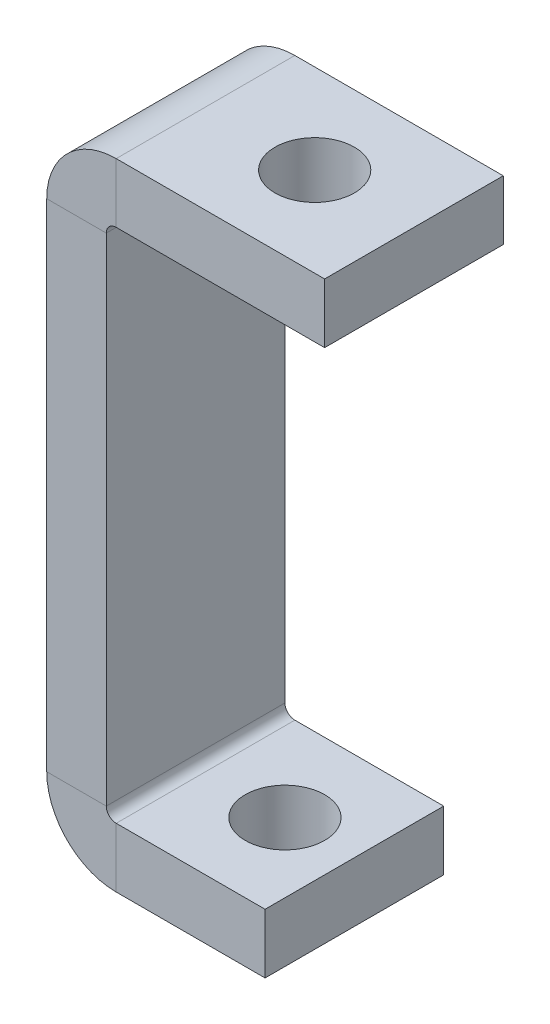
ISO-10303-21;
HEADER;
FILE_DESCRIPTION(('STEP AP214'),'2;1');
FILE_NAME('part.step','',(''),(''),'','','');
FILE_SCHEMA(('AUTOMOTIVE_DESIGN { 1 0 10303 214 1 1 1 1 }'));
ENDSEC;
DATA;
#1=APPLICATION_CONTEXT('core data for automotive mechanical design processes');
#2=APPLICATION_PROTOCOL_DEFINITION('international standard','automotive_design',2000,#1);
#3=PRODUCT_CONTEXT('',#1,'mechanical');
#4=PRODUCT('Part','Part','',(#3));
#5=PRODUCT_RELATED_PRODUCT_CATEGORY('part','',(#4));
#6=PRODUCT_DEFINITION_FORMATION('','',#4);
#7=PRODUCT_DEFINITION_CONTEXT('part definition',#1,'design');
#8=PRODUCT_DEFINITION('design','',#6,#7);
#9=PRODUCT_DEFINITION_SHAPE('','',#8);
#10=(LENGTH_UNIT() NAMED_UNIT(*) SI_UNIT(.MILLI.,.METRE.));
#11=(NAMED_UNIT(*) PLANE_ANGLE_UNIT() SI_UNIT($,.RADIAN.));
#12=(NAMED_UNIT(*) SI_UNIT($,.STERADIAN.) SOLID_ANGLE_UNIT());
#13=UNCERTAINTY_MEASURE_WITH_UNIT(LENGTH_MEASURE(1.E-05),#10,'distance_accuracy_value','');
#14=(GEOMETRIC_REPRESENTATION_CONTEXT(3) GLOBAL_UNCERTAINTY_ASSIGNED_CONTEXT((#13)) GLOBAL_UNIT_ASSIGNED_CONTEXT((#10,
#11,#12)) REPRESENTATION_CONTEXT('',''));
#15=CARTESIAN_POINT('',(0.,0.,0.));
#16=DIRECTION('',(0.,0.,1.));
#17=DIRECTION('',(1.,0.,0.));
#18=AXIS2_PLACEMENT_3D('',#15,#16,#17);
#19=CARTESIAN_POINT('',(0.,0.,0.));
#20=DIRECTION('',(1.,0.,0.));
#21=DIRECTION('',(0.,0.,-1.));
#22=AXIS2_PLACEMENT_3D('',#19,#20,#21);
#23=PLANE('',#22);
#24=DIRECTION('',(0.,-1.,0.));
#25=VECTOR('',#24,1.);
#26=CARTESIAN_POINT('',(0.,0.,4.5));
#27=LINE('',#26,#25);
#28=CARTESIAN_POINT('',(0.,0.,4.5));
#29=VERTEX_POINT('',#28);
#30=CARTESIAN_POINT('',(0.,-3.,4.5));
#31=VERTEX_POINT('',#30);
#32=EDGE_CURVE('E149',#29,#31,#27,.T.);
#33=ORIENTED_EDGE('',*,*,#32,.T.);
#34=DIRECTION('',(0.,0.,-1.));
#35=VECTOR('',#34,1.);
#36=CARTESIAN_POINT('',(0.,-3.,4.5));
#37=LINE('',#36,#35);
#38=CARTESIAN_POINT('',(0.,-3.,-4.5));
#39=VERTEX_POINT('',#38);
#40=EDGE_CURVE('E160',#31,#39,#37,.T.);
#41=ORIENTED_EDGE('',*,*,#40,.T.);
#42=DIRECTION('',(0.,1.,0.));
#43=VECTOR('',#42,1.);
#44=CARTESIAN_POINT('',(0.,0.,-4.5));
#45=LINE('',#44,#43);
#46=CARTESIAN_POINT('',(0.,0.,-4.5));
#47=VERTEX_POINT('',#46);
#48=EDGE_CURVE('E165',#39,#47,#45,.T.);
#49=ORIENTED_EDGE('',*,*,#48,.T.);
#50=DIRECTION('',(0.,0.,1.));
#51=VECTOR('',#50,1.);
#52=CARTESIAN_POINT('',(0.,0.,4.5));
#53=LINE('',#52,#51);
#54=EDGE_CURVE('E164',#47,#29,#53,.T.);
#55=ORIENTED_EDGE('',*,*,#54,.T.);
#56=EDGE_LOOP('',(#33,#41,#49,#55));
#57=FACE_BOUND('',#56,.T.);
#58=ADVANCED_FACE('F38',(#57),#23,.T.);
#59=CARTESIAN_POINT('',(3.,26.,0.));
#60=DIRECTION('',(-1.,0.,0.));
#61=DIRECTION('',(0.,0.,-1.));
#62=AXIS2_PLACEMENT_3D('',#59,#60,#61);
#63=PLANE('',#62);
#64=DIRECTION('',(0.,1.,0.));
#65=VECTOR('',#64,1.);
#66=CARTESIAN_POINT('',(3.,26.,4.5));
#67=LINE('',#66,#65);
#68=CARTESIAN_POINT('',(3.,26.,4.5));
#69=VERTEX_POINT('',#68);
#70=CARTESIAN_POINT('',(3.,29.,4.5));
#71=VERTEX_POINT('',#70);
#72=EDGE_CURVE('E221',#69,#71,#67,.T.);
#73=ORIENTED_EDGE('',*,*,#72,.F.);
#74=DIRECTION('',(0.,0.,1.));
#75=VECTOR('',#74,1.);
#76=CARTESIAN_POINT('',(3.,26.,4.5));
#77=LINE('',#76,#75);
#78=CARTESIAN_POINT('',(3.,26.,-4.5));
#79=VERTEX_POINT('',#78);
#80=EDGE_CURVE('E11',#79,#69,#77,.T.);
#81=ORIENTED_EDGE('',*,*,#80,.F.);
#82=DIRECTION('',(0.,-1.,0.));
#83=VECTOR('',#82,1.);
#84=CARTESIAN_POINT('',(3.,26.,-4.5));
#85=LINE('',#84,#83);
#86=CARTESIAN_POINT('',(3.,29.,-4.5));
#87=VERTEX_POINT('',#86);
#88=EDGE_CURVE('E55',#87,#79,#85,.T.);
#89=ORIENTED_EDGE('',*,*,#88,.F.);
#90=DIRECTION('',(0.,0.,-1.));
#91=VECTOR('',#90,1.);
#92=CARTESIAN_POINT('',(3.,29.,4.5));
#93=LINE('',#92,#91);
#94=EDGE_CURVE('E64',#71,#87,#93,.T.);
#95=ORIENTED_EDGE('',*,*,#94,.F.);
#96=EDGE_LOOP('',(#73,#81,#89,#95));
#97=FACE_BOUND('',#96,.T.);
#98=ADVANCED_FACE('F370',(#97),#63,.F.);
#99=CARTESIAN_POINT('',(0.,0.,4.5));
#100=DIRECTION('',(0.,0.,-1.));
#101=DIRECTION('',(0.,1.,0.));
#102=AXIS2_PLACEMENT_3D('',#99,#100,#101);
#103=PLANE('',#102);
#104=DIRECTION('',(-1.,0.,0.));
#105=VECTOR('',#104,1.);
#106=CARTESIAN_POINT('',(0.,-3.,4.5));
#107=LINE('',#106,#105);
#108=CARTESIAN_POINT('',(-7.5,-3.,4.5));
#109=VERTEX_POINT('',#108);
#110=EDGE_CURVE('E156',#31,#109,#107,.T.);
#111=ORIENTED_EDGE('',*,*,#110,.F.);
#112=ORIENTED_EDGE('',*,*,#32,.F.);
#113=DIRECTION('',(-1.,0.,0.));
#114=VECTOR('',#113,1.);
#115=CARTESIAN_POINT('',(0.,0.,4.5));
#116=LINE('',#115,#114);
#117=CARTESIAN_POINT('',(-7.5,0.,4.5));
#118=VERTEX_POINT('',#117);
#119=EDGE_CURVE('E154',#29,#118,#116,.T.);
#120=ORIENTED_EDGE('',*,*,#119,.T.);
#121=DIRECTION('',(0.,-1.,0.));
#122=VECTOR('',#121,1.);
#123=CARTESIAN_POINT('',(-7.5,0.,4.5));
#124=LINE('',#123,#122);
#125=EDGE_CURVE('E177',#118,#109,#124,.T.);
#126=ORIENTED_EDGE('',*,*,#125,.T.);
#127=EDGE_LOOP('',(#111,#112,#120,#126));
#128=FACE_BOUND('',#127,.T.);
#129=ADVANCED_FACE('F151',(#128),#103,.F.);
#130=CARTESIAN_POINT('',(0.,-3.,4.5));
#131=DIRECTION('',(0.,1.,0.));
#132=DIRECTION('',(0.,0.,1.));
#133=AXIS2_PLACEMENT_3D('',#130,#131,#132);
#134=PLANE('',#133);
#135=CARTESIAN_POINT('',(-3.5,-3.,0.));
#136=DIRECTION('',(0.,-1.,0.));
#137=DIRECTION('',(0.,0.,-1.));
#138=AXIS2_PLACEMENT_3D('',#135,#136,#137);
#139=CIRCLE('',#138,2.);
#140=CARTESIAN_POINT('',(-3.5,-3.,-2.));
#141=VERTEX_POINT('',#140);
#142=EDGE_CURVE('E322',#141,#141,#139,.T.);
#143=ORIENTED_EDGE('',*,*,#142,.F.);
#144=EDGE_LOOP('',(#143));
#145=FACE_BOUND('',#144,.T.);
#146=DIRECTION('',(-1.,0.,0.));
#147=VECTOR('',#146,1.);
#148=CARTESIAN_POINT('',(0.,-3.,-4.5));
#149=LINE('',#148,#147);
#150=CARTESIAN_POINT('',(-7.5,-3.,-4.5));
#151=VERTEX_POINT('',#150);
#152=EDGE_CURVE('E237',#39,#151,#149,.T.);
#153=ORIENTED_EDGE('',*,*,#152,.F.);
#154=ORIENTED_EDGE('',*,*,#40,.F.);
#155=ORIENTED_EDGE('',*,*,#110,.T.);
#156=DIRECTION('',(0.,0.,-1.));
#157=VECTOR('',#156,1.);
#158=CARTESIAN_POINT('',(-7.5,-3.,4.5));
#159=LINE('',#158,#157);
#160=EDGE_CURVE('E233',#109,#151,#159,.T.);
#161=ORIENTED_EDGE('',*,*,#160,.T.);
#162=EDGE_LOOP('',(#153,#154,#155,#161));
#163=FACE_BOUND('',#162,.T.);
#164=ADVANCED_FACE('F331',(#145,#163),#134,.F.);
#165=CARTESIAN_POINT('',(0.,0.,-4.5));
#166=DIRECTION('',(0.,0.,1.));
#167=DIRECTION('',(0.,-1.,0.));
#168=AXIS2_PLACEMENT_3D('',#165,#166,#167);
#169=PLANE('',#168);
#170=DIRECTION('',(-1.,0.,0.));
#171=VECTOR('',#170,1.);
#172=CARTESIAN_POINT('',(0.,0.,-4.5));
#173=LINE('',#172,#171);
#174=CARTESIAN_POINT('',(-7.5,0.,-4.5));
#175=VERTEX_POINT('',#174);
#176=EDGE_CURVE('E272',#47,#175,#173,.T.);
#177=ORIENTED_EDGE('',*,*,#176,.F.);
#178=ORIENTED_EDGE('',*,*,#48,.F.);
#179=ORIENTED_EDGE('',*,*,#152,.T.);
#180=DIRECTION('',(0.,1.,0.));
#181=VECTOR('',#180,1.);
#182=CARTESIAN_POINT('',(-7.5,0.,-4.5));
#183=LINE('',#182,#181);
#184=EDGE_CURVE('E241',#151,#175,#183,.T.);
#185=ORIENTED_EDGE('',*,*,#184,.T.);
#186=EDGE_LOOP('',(#177,#178,#179,#185));
#187=FACE_BOUND('',#186,.T.);
#188=ADVANCED_FACE('F334',(#187),#169,.F.);
#189=CARTESIAN_POINT('',(0.,0.,4.5));
#190=DIRECTION('',(0.,-1.,0.));
#191=DIRECTION('',(1.,0.,0.));
#192=AXIS2_PLACEMENT_3D('',#189,#190,#191);
#193=PLANE('',#192);
#194=CARTESIAN_POINT('',(-3.5,0.,0.));
#195=DIRECTION('',(0.,-1.,0.));
#196=DIRECTION('',(1.,0.,0.));
#197=AXIS2_PLACEMENT_3D('',#194,#195,#196);
#198=CIRCLE('',#197,2.);
#199=CARTESIAN_POINT('',(-1.5,0.,0.));
#200=VERTEX_POINT('',#199);
#201=EDGE_CURVE('E41',#200,#200,#198,.T.);
#202=ORIENTED_EDGE('',*,*,#201,.T.);
#203=EDGE_LOOP('',(#202));
#204=FACE_BOUND('',#203,.T.);
#205=DIRECTION('',(0.,0.,1.));
#206=VECTOR('',#205,1.);
#207=CARTESIAN_POINT('',(-7.5,0.,4.5));
#208=LINE('',#207,#206);
#209=EDGE_CURVE('E174',#175,#118,#208,.T.);
#210=ORIENTED_EDGE('',*,*,#209,.T.);
#211=ORIENTED_EDGE('',*,*,#119,.F.);
#212=ORIENTED_EDGE('',*,*,#54,.F.);
#213=ORIENTED_EDGE('',*,*,#176,.T.);
#214=EDGE_LOOP('',(#210,#211,#212,#213));
#215=FACE_BOUND('',#214,.T.);
#216=ADVANCED_FACE('F172',(#204,#215),#193,.F.);
#217=CARTESIAN_POINT('',(-7.5,0.,4.5));
#218=DIRECTION('',(0.,0.,-1.));
#219=DIRECTION('',(-1.,0.,0.));
#220=AXIS2_PLACEMENT_3D('',#217,#218,#219);
#221=PLANE('',#220);
#222=CARTESIAN_POINT('',(-7.5,0.499999999999999,4.5));
#223=DIRECTION('',(0.,0.,-1.));
#224=DIRECTION('',(0.,-1.,0.));
#225=AXIS2_PLACEMENT_3D('',#222,#223,#224);
#226=CIRCLE('',#225,3.5);
#227=CARTESIAN_POINT('',(-11.,0.499999999999999,4.5));
#228=VERTEX_POINT('',#227);
#229=EDGE_CURVE('E187',#109,#228,#226,.T.);
#230=ORIENTED_EDGE('',*,*,#229,.F.);
#231=ORIENTED_EDGE('',*,*,#125,.F.);
#232=CARTESIAN_POINT('',(-7.5,0.499999999999999,4.5));
#233=DIRECTION('',(0.,0.,-1.));
#234=DIRECTION('',(0.,-1.,0.));
#235=AXIS2_PLACEMENT_3D('',#232,#233,#234);
#236=CIRCLE('',#235,0.5);
#237=CARTESIAN_POINT('',(-8.,0.499999999999999,4.5));
#238=VERTEX_POINT('',#237);
#239=EDGE_CURVE('E188',#118,#238,#236,.T.);
#240=ORIENTED_EDGE('',*,*,#239,.T.);
#241=DIRECTION('',(-1.,0.,0.));
#242=VECTOR('',#241,1.);
#243=CARTESIAN_POINT('',(-8.,0.499999999999999,4.5));
#244=LINE('',#243,#242);
#245=EDGE_CURVE('E183',#238,#228,#244,.T.);
#246=ORIENTED_EDGE('',*,*,#245,.T.);
#247=EDGE_LOOP('',(#230,#231,#240,#246));
#248=FACE_BOUND('',#247,.T.);
#249=ADVANCED_FACE('F348',(#248),#221,.F.);
#250=CARTESIAN_POINT('',(-7.5,0.499999999999999,0.));
#251=DIRECTION('',(0.,0.,-1.));
#252=DIRECTION('',(-1.,0.,0.));
#253=AXIS2_PLACEMENT_3D('',#250,#251,#252);
#254=CYLINDRICAL_SURFACE('',#253,3.5);
#255=CARTESIAN_POINT('',(-7.5,0.499999999999999,-4.5));
#256=DIRECTION('',(0.,0.,-1.));
#257=DIRECTION('',(0.,-1.,0.));
#258=AXIS2_PLACEMENT_3D('',#255,#256,#257);
#259=CIRCLE('',#258,3.5);
#260=CARTESIAN_POINT('',(-11.,0.499999999999999,-4.5));
#261=VERTEX_POINT('',#260);
#262=EDGE_CURVE('E245',#151,#261,#259,.T.);
#263=ORIENTED_EDGE('',*,*,#262,.F.);
#264=ORIENTED_EDGE('',*,*,#160,.F.);
#265=ORIENTED_EDGE('',*,*,#229,.T.);
#266=DIRECTION('',(0.,0.,-1.));
#267=VECTOR('',#266,1.);
#268=CARTESIAN_POINT('',(-11.,0.499999999999999,4.5));
#269=LINE('',#268,#267);
#270=EDGE_CURVE('E192',#228,#261,#269,.T.);
#271=ORIENTED_EDGE('',*,*,#270,.T.);
#272=EDGE_LOOP('',(#263,#264,#265,#271));
#273=FACE_BOUND('',#272,.T.);
#274=ADVANCED_FACE('F350',(#273),#254,.T.);
#275=CARTESIAN_POINT('',(-7.5,0.,-4.5));
#276=DIRECTION('',(0.,0.,1.));
#277=DIRECTION('',(1.,0.,0.));
#278=AXIS2_PLACEMENT_3D('',#275,#276,#277);
#279=PLANE('',#278);
#280=CARTESIAN_POINT('',(-7.5,0.499999999999999,-4.5));
#281=DIRECTION('',(0.,0.,-1.));
#282=DIRECTION('',(0.,-1.,0.));
#283=AXIS2_PLACEMENT_3D('',#280,#281,#282);
#284=CIRCLE('',#283,0.5);
#285=CARTESIAN_POINT('',(-8.,0.499999999999999,-4.5));
#286=VERTEX_POINT('',#285);
#287=EDGE_CURVE('E278',#175,#286,#284,.T.);
#288=ORIENTED_EDGE('',*,*,#287,.F.);
#289=ORIENTED_EDGE('',*,*,#184,.F.);
#290=ORIENTED_EDGE('',*,*,#262,.T.);
#291=DIRECTION('',(1.,0.,0.));
#292=VECTOR('',#291,1.);
#293=CARTESIAN_POINT('',(-8.,0.499999999999999,-4.5));
#294=LINE('',#293,#292);
#295=EDGE_CURVE('E249',#261,#286,#294,.T.);
#296=ORIENTED_EDGE('',*,*,#295,.T.);
#297=EDGE_LOOP('',(#288,#289,#290,#296));
#298=FACE_BOUND('',#297,.T.);
#299=ADVANCED_FACE('F341',(#298),#279,.F.);
#300=CARTESIAN_POINT('',(-7.5,0.499999999999999,0.));
#301=DIRECTION('',(0.,0.,-1.));
#302=DIRECTION('',(-1.,0.,0.));
#303=AXIS2_PLACEMENT_3D('',#300,#301,#302);
#304=CYLINDRICAL_SURFACE('',#303,0.5);
#305=DIRECTION('',(0.,0.,1.));
#306=VECTOR('',#305,1.);
#307=CARTESIAN_POINT('',(-8.,0.499999999999999,4.5));
#308=LINE('',#307,#306);
#309=EDGE_CURVE('E209',#286,#238,#308,.T.);
#310=ORIENTED_EDGE('',*,*,#309,.T.);
#311=ORIENTED_EDGE('',*,*,#239,.F.);
#312=ORIENTED_EDGE('',*,*,#209,.F.);
#313=ORIENTED_EDGE('',*,*,#287,.T.);
#314=EDGE_LOOP('',(#310,#311,#312,#313));
#315=FACE_BOUND('',#314,.T.);
#316=ADVANCED_FACE('F344',(#315),#304,.F.);
#317=CARTESIAN_POINT('',(-8.,0.499999999999999,4.5));
#318=DIRECTION('',(0.,0.,-1.));
#319=DIRECTION('',(-1.,0.,0.));
#320=AXIS2_PLACEMENT_3D('',#317,#318,#319);
#321=PLANE('',#320);
#322=DIRECTION('',(0.,1.,0.));
#323=VECTOR('',#322,1.);
#324=CARTESIAN_POINT('',(-11.,0.499999999999999,4.5));
#325=LINE('',#324,#323);
#326=CARTESIAN_POINT('',(-11.,25.5,4.5));
#327=VERTEX_POINT('',#326);
#328=EDGE_CURVE('E200',#228,#327,#325,.T.);
#329=ORIENTED_EDGE('',*,*,#328,.F.);
#330=ORIENTED_EDGE('',*,*,#245,.F.);
#331=DIRECTION('',(0.,1.,0.));
#332=VECTOR('',#331,1.);
#333=CARTESIAN_POINT('',(-8.,0.499999999999999,4.5));
#334=LINE('',#333,#332);
#335=CARTESIAN_POINT('',(-8.,25.5,4.5));
#336=VERTEX_POINT('',#335);
#337=EDGE_CURVE('E201',#238,#336,#334,.T.);
#338=ORIENTED_EDGE('',*,*,#337,.T.);
#339=DIRECTION('',(-1.,0.,0.));
#340=VECTOR('',#339,1.);
#341=CARTESIAN_POINT('',(-8.,25.5,4.5));
#342=LINE('',#341,#340);
#343=EDGE_CURVE('E196',#336,#327,#342,.T.);
#344=ORIENTED_EDGE('',*,*,#343,.T.);
#345=EDGE_LOOP('',(#329,#330,#338,#344));
#346=FACE_BOUND('',#345,.T.);
#347=ADVANCED_FACE('F361',(#346),#321,.F.);
#348=CARTESIAN_POINT('',(-11.,0.499999999999999,4.5));
#349=DIRECTION('',(1.,0.,0.));
#350=DIRECTION('',(0.,0.,-1.));
#351=AXIS2_PLACEMENT_3D('',#348,#349,#350);
#352=PLANE('',#351);
#353=DIRECTION('',(0.,1.,0.));
#354=VECTOR('',#353,1.);
#355=CARTESIAN_POINT('',(-11.,0.499999999999999,-4.5));
#356=LINE('',#355,#354);
#357=CARTESIAN_POINT('',(-11.,25.5,-4.5));
#358=VERTEX_POINT('',#357);
#359=EDGE_CURVE('E253',#261,#358,#356,.T.);
#360=ORIENTED_EDGE('',*,*,#359,.F.);
#361=ORIENTED_EDGE('',*,*,#270,.F.);
#362=ORIENTED_EDGE('',*,*,#328,.T.);
#363=DIRECTION('',(0.,0.,-1.));
#364=VECTOR('',#363,1.);
#365=CARTESIAN_POINT('',(-11.,25.5,4.5));
#366=LINE('',#365,#364);
#367=EDGE_CURVE('E205',#327,#358,#366,.T.);
#368=ORIENTED_EDGE('',*,*,#367,.T.);
#369=EDGE_LOOP('',(#360,#361,#362,#368));
#370=FACE_BOUND('',#369,.T.);
#371=ADVANCED_FACE('F354',(#370),#352,.F.);
#372=CARTESIAN_POINT('',(-8.,0.499999999999999,-4.5));
#373=DIRECTION('',(0.,0.,1.));
#374=DIRECTION('',(1.,0.,0.));
#375=AXIS2_PLACEMENT_3D('',#372,#373,#374);
#376=PLANE('',#375);
#377=DIRECTION('',(0.,1.,0.));
#378=VECTOR('',#377,1.);
#379=CARTESIAN_POINT('',(-8.,0.499999999999999,-4.5));
#380=LINE('',#379,#378);
#381=CARTESIAN_POINT('',(-8.,25.5,-4.5));
#382=VERTEX_POINT('',#381);
#383=EDGE_CURVE('E285',#286,#382,#380,.T.);
#384=ORIENTED_EDGE('',*,*,#383,.F.);
#385=ORIENTED_EDGE('',*,*,#295,.F.);
#386=ORIENTED_EDGE('',*,*,#359,.T.);
#387=DIRECTION('',(1.,0.,0.));
#388=VECTOR('',#387,1.);
#389=CARTESIAN_POINT('',(-8.,25.5,-4.5));
#390=LINE('',#389,#388);
#391=EDGE_CURVE('E257',#358,#382,#390,.T.);
#392=ORIENTED_EDGE('',*,*,#391,.T.);
#393=EDGE_LOOP('',(#384,#385,#386,#392));
#394=FACE_BOUND('',#393,.T.);
#395=ADVANCED_FACE('F356',(#394),#376,.F.);
#396=CARTESIAN_POINT('',(-8.,0.499999999999999,4.5));
#397=DIRECTION('',(-1.,0.,0.));
#398=DIRECTION('',(0.,0.,1.));
#399=AXIS2_PLACEMENT_3D('',#396,#397,#398);
#400=PLANE('',#399);
#401=DIRECTION('',(0.,0.,1.));
#402=VECTOR('',#401,1.);
#403=CARTESIAN_POINT('',(-8.,25.5,4.5));
#404=LINE('',#403,#402);
#405=EDGE_CURVE('E220',#382,#336,#404,.T.);
#406=ORIENTED_EDGE('',*,*,#405,.T.);
#407=ORIENTED_EDGE('',*,*,#337,.F.);
#408=ORIENTED_EDGE('',*,*,#309,.F.);
#409=ORIENTED_EDGE('',*,*,#383,.T.);
#410=EDGE_LOOP('',(#406,#407,#408,#409));
#411=FACE_BOUND('',#410,.T.);
#412=ADVANCED_FACE('F358',(#411),#400,.F.);
#413=CARTESIAN_POINT('',(-8.,25.5,4.5));
#414=DIRECTION('',(0.,0.,-1.));
#415=DIRECTION('',(-1.,0.,0.));
#416=AXIS2_PLACEMENT_3D('',#413,#414,#415);
#417=PLANE('',#416);
#418=CARTESIAN_POINT('',(-7.5,25.5,4.5));
#419=DIRECTION('',(0.,0.,-1.));
#420=DIRECTION('',(-1.,0.,0.));
#421=AXIS2_PLACEMENT_3D('',#418,#419,#420);
#422=CIRCLE('',#421,3.5);
#423=CARTESIAN_POINT('',(-7.49999999999998,29.,4.5));
#424=VERTEX_POINT('',#423);
#425=EDGE_CURVE('E129',#327,#424,#422,.T.);
#426=ORIENTED_EDGE('',*,*,#425,.F.);
#427=ORIENTED_EDGE('',*,*,#343,.F.);
#428=CARTESIAN_POINT('',(-7.5,25.5,4.5));
#429=DIRECTION('',(0.,0.,-1.));
#430=DIRECTION('',(-1.,0.,0.));
#431=AXIS2_PLACEMENT_3D('',#428,#429,#430);
#432=CIRCLE('',#431,0.5);
#433=CARTESIAN_POINT('',(-7.5,26.,4.5));
#434=VERTEX_POINT('',#433);
#435=EDGE_CURVE('E213',#336,#434,#432,.T.);
#436=ORIENTED_EDGE('',*,*,#435,.T.);
#437=DIRECTION('',(0.,1.,0.));
#438=VECTOR('',#437,1.);
#439=CARTESIAN_POINT('',(-7.5,26.,4.5));
#440=LINE('',#439,#438);
#441=EDGE_CURVE('E210',#434,#424,#440,.T.);
#442=ORIENTED_EDGE('',*,*,#441,.T.);
#443=EDGE_LOOP('',(#426,#427,#436,#442));
#444=FACE_BOUND('',#443,.T.);
#445=ADVANCED_FACE('F362',(#444),#417,.F.);
#446=CARTESIAN_POINT('',(-7.5,25.5,0.));
#447=DIRECTION('',(0.,0.,-1.));
#448=DIRECTION('',(-1.,0.,0.));
#449=AXIS2_PLACEMENT_3D('',#446,#447,#448);
#450=CYLINDRICAL_SURFACE('',#449,3.5);
#451=CARTESIAN_POINT('',(-7.5,25.5,-4.5));
#452=DIRECTION('',(0.,0.,-1.));
#453=DIRECTION('',(-1.,0.,0.));
#454=AXIS2_PLACEMENT_3D('',#451,#452,#453);
#455=CIRCLE('',#454,3.5);
#456=CARTESIAN_POINT('',(-7.49999999999998,29.,-4.5));
#457=VERTEX_POINT('',#456);
#458=EDGE_CURVE('E122',#358,#457,#455,.T.);
#459=ORIENTED_EDGE('',*,*,#458,.F.);
#460=ORIENTED_EDGE('',*,*,#367,.F.);
#461=ORIENTED_EDGE('',*,*,#425,.T.);
#462=DIRECTION('',(0.,0.,-1.));
#463=VECTOR('',#462,1.);
#464=CARTESIAN_POINT('',(-7.49999999999998,29.,4.5));
#465=LINE('',#464,#463);
#466=EDGE_CURVE('E216',#424,#457,#465,.T.);
#467=ORIENTED_EDGE('',*,*,#466,.T.);
#468=EDGE_LOOP('',(#459,#460,#461,#467));
#469=FACE_BOUND('',#468,.T.);
#470=ADVANCED_FACE('F372',(#469),#450,.T.);
#471=CARTESIAN_POINT('',(-8.,25.5,-4.5));
#472=DIRECTION('',(0.,0.,1.));
#473=DIRECTION('',(1.,0.,0.));
#474=AXIS2_PLACEMENT_3D('',#471,#472,#473);
#475=PLANE('',#474);
#476=CARTESIAN_POINT('',(-7.5,25.5,-4.5));
#477=DIRECTION('',(0.,0.,-1.));
#478=DIRECTION('',(-1.,0.,0.));
#479=AXIS2_PLACEMENT_3D('',#476,#477,#478);
#480=CIRCLE('',#479,0.5);
#481=CARTESIAN_POINT('',(-7.5,26.,-4.5));
#482=VERTEX_POINT('',#481);
#483=EDGE_CURVE('E292',#382,#482,#480,.T.);
#484=ORIENTED_EDGE('',*,*,#483,.F.);
#485=ORIENTED_EDGE('',*,*,#391,.F.);
#486=ORIENTED_EDGE('',*,*,#458,.T.);
#487=DIRECTION('',(0.,-1.,0.));
#488=VECTOR('',#487,1.);
#489=CARTESIAN_POINT('',(-7.5,26.,-4.5));
#490=LINE('',#489,#488);
#491=EDGE_CURVE('E262',#457,#482,#490,.T.);
#492=ORIENTED_EDGE('',*,*,#491,.T.);
#493=EDGE_LOOP('',(#484,#485,#486,#492));
#494=FACE_BOUND('',#493,.T.);
#495=ADVANCED_FACE('F374',(#494),#475,.F.);
#496=CARTESIAN_POINT('',(-7.5,25.5,0.));
#497=DIRECTION('',(0.,0.,-1.));
#498=DIRECTION('',(-1.,0.,0.));
#499=AXIS2_PLACEMENT_3D('',#496,#497,#498);
#500=CYLINDRICAL_SURFACE('',#499,0.5);
#501=DIRECTION('',(0.,0.,1.));
#502=VECTOR('',#501,1.);
#503=CARTESIAN_POINT('',(-7.5,26.,4.5));
#504=LINE('',#503,#502);
#505=EDGE_CURVE('E230',#482,#434,#504,.T.);
#506=ORIENTED_EDGE('',*,*,#505,.T.);
#507=ORIENTED_EDGE('',*,*,#435,.F.);
#508=ORIENTED_EDGE('',*,*,#405,.F.);
#509=ORIENTED_EDGE('',*,*,#483,.T.);
#510=EDGE_LOOP('',(#506,#507,#508,#509));
#511=FACE_BOUND('',#510,.T.);
#512=ADVANCED_FACE('F364',(#511),#500,.F.);
#513=CARTESIAN_POINT('',(-7.5,26.,4.5));
#514=DIRECTION('',(0.,0.,-1.));
#515=DIRECTION('',(0.,1.,0.));
#516=AXIS2_PLACEMENT_3D('',#513,#514,#515);
#517=PLANE('',#516);
#518=DIRECTION('',(1.,0.,0.));
#519=VECTOR('',#518,1.);
#520=CARTESIAN_POINT('',(-7.49999999999999,29.,4.5));
#521=LINE('',#520,#519);
#522=EDGE_CURVE('E103',#424,#71,#521,.T.);
#523=ORIENTED_EDGE('',*,*,#522,.F.);
#524=ORIENTED_EDGE('',*,*,#441,.F.);
#525=DIRECTION('',(1.,0.,0.));
#526=VECTOR('',#525,1.);
#527=CARTESIAN_POINT('',(-7.5,26.,4.5));
#528=LINE('',#527,#526);
#529=EDGE_CURVE('E224',#434,#69,#528,.T.);
#530=ORIENTED_EDGE('',*,*,#529,.T.);
#531=ORIENTED_EDGE('',*,*,#72,.T.);
#532=EDGE_LOOP('',(#523,#524,#530,#531));
#533=FACE_BOUND('',#532,.T.);
#534=ADVANCED_FACE('F366',(#533),#517,.F.);
#535=CARTESIAN_POINT('',(-7.49999999999999,29.,4.5));
#536=DIRECTION('',(0.,-1.,0.));
#537=DIRECTION('',(1.,0.,0.));
#538=AXIS2_PLACEMENT_3D('',#535,#536,#537);
#539=PLANE('',#538);
#540=CARTESIAN_POINT('',(-2.,29.,0.));
#541=DIRECTION('',(0.,1.,0.));
#542=DIRECTION('',(-1.,0.,0.));
#543=AXIS2_PLACEMENT_3D('',#540,#541,#542);
#544=CIRCLE('',#543,2.);
#545=CARTESIAN_POINT('',(-4.,29.,0.));
#546=VERTEX_POINT('',#545);
#547=EDGE_CURVE('E312',#546,#546,#544,.T.);
#548=ORIENTED_EDGE('',*,*,#547,.F.);
#549=EDGE_LOOP('',(#548));
#550=FACE_BOUND('',#549,.T.);
#551=DIRECTION('',(1.,0.,0.));
#552=VECTOR('',#551,1.);
#553=CARTESIAN_POINT('',(-7.49999999999999,29.,-4.5));
#554=LINE('',#553,#552);
#555=EDGE_CURVE('E98',#457,#87,#554,.T.);
#556=ORIENTED_EDGE('',*,*,#555,.F.);
#557=ORIENTED_EDGE('',*,*,#466,.F.);
#558=ORIENTED_EDGE('',*,*,#522,.T.);
#559=ORIENTED_EDGE('',*,*,#94,.T.);
#560=EDGE_LOOP('',(#556,#557,#558,#559));
#561=FACE_BOUND('',#560,.T.);
#562=ADVANCED_FACE('F371',(#550,#561),#539,.F.);
#563=CARTESIAN_POINT('',(-7.5,26.,-4.5));
#564=DIRECTION('',(0.,0.,1.));
#565=DIRECTION('',(0.,-1.,0.));
#566=AXIS2_PLACEMENT_3D('',#563,#564,#565);
#567=PLANE('',#566);
#568=DIRECTION('',(1.,0.,0.));
#569=VECTOR('',#568,1.);
#570=CARTESIAN_POINT('',(-7.5,26.,-4.5));
#571=LINE('',#570,#569);
#572=EDGE_CURVE('E47',#482,#79,#571,.T.);
#573=ORIENTED_EDGE('',*,*,#572,.F.);
#574=ORIENTED_EDGE('',*,*,#491,.F.);
#575=ORIENTED_EDGE('',*,*,#555,.T.);
#576=ORIENTED_EDGE('',*,*,#88,.T.);
#577=EDGE_LOOP('',(#573,#574,#575,#576));
#578=FACE_BOUND('',#577,.T.);
#579=ADVANCED_FACE('F387',(#578),#567,.F.);
#580=CARTESIAN_POINT('',(-7.5,26.,4.5));
#581=DIRECTION('',(0.,1.,0.));
#582=DIRECTION('',(-1.,0.,0.));
#583=AXIS2_PLACEMENT_3D('',#580,#581,#582);
#584=PLANE('',#583);
#585=CARTESIAN_POINT('',(-2.,26.,0.));
#586=DIRECTION('',(0.,1.,0.));
#587=DIRECTION('',(-1.,0.,0.));
#588=AXIS2_PLACEMENT_3D('',#585,#586,#587);
#589=CIRCLE('',#588,2.);
#590=CARTESIAN_POINT('',(-4.00000000000001,26.,0.));
#591=VERTEX_POINT('',#590);
#592=EDGE_CURVE('E161',#591,#591,#589,.T.);
#593=ORIENTED_EDGE('',*,*,#592,.T.);
#594=EDGE_LOOP('',(#593));
#595=FACE_BOUND('',#594,.T.);
#596=ORIENTED_EDGE('',*,*,#80,.T.);
#597=ORIENTED_EDGE('',*,*,#529,.F.);
#598=ORIENTED_EDGE('',*,*,#505,.F.);
#599=ORIENTED_EDGE('',*,*,#572,.T.);
#600=EDGE_LOOP('',(#596,#597,#598,#599));
#601=FACE_BOUND('',#600,.T.);
#602=ADVANCED_FACE('F368',(#595,#601),#584,.F.);
#603=CARTESIAN_POINT('',(-2.00000000000001,19.,0.));
#604=DIRECTION('',(0.,1.,0.));
#605=DIRECTION('',(-1.,0.,0.));
#606=AXIS2_PLACEMENT_3D('',#603,#604,#605);
#607=CYLINDRICAL_SURFACE('',#606,2.);
#608=ORIENTED_EDGE('',*,*,#547,.T.);
#609=EDGE_LOOP('',(#608));
#610=FACE_BOUND('',#609,.T.);
#611=ORIENTED_EDGE('',*,*,#592,.F.);
#612=EDGE_LOOP('',(#611));
#613=FACE_BOUND('',#612,.T.);
#614=ADVANCED_FACE('F386',(#610,#613),#607,.F.);
#615=CARTESIAN_POINT('',(-3.5,7.,0.));
#616=DIRECTION('',(0.,-1.,0.));
#617=DIRECTION('',(0.,0.,-1.));
#618=AXIS2_PLACEMENT_3D('',#615,#616,#617);
#619=CYLINDRICAL_SURFACE('',#618,2.);
#620=ORIENTED_EDGE('',*,*,#142,.T.);
#621=EDGE_LOOP('',(#620));
#622=FACE_BOUND('',#621,.T.);
#623=ORIENTED_EDGE('',*,*,#201,.F.);
#624=EDGE_LOOP('',(#623));
#625=FACE_BOUND('',#624,.T.);
#626=ADVANCED_FACE('F328',(#622,#625),#619,.F.);
#627=CLOSED_SHELL('',(#58,#98,#129,#164,#188,#216,#249,#274,#299,#316,#347,#371,#395,#412,#445,
#470,#495,#512,#534,#562,#579,#602,#614,#626));
#628=MANIFOLD_SOLID_BREP('B2',#627);
#629=ADVANCED_BREP_SHAPE_REPRESENTATION('',(#18,#628),#14);
#630=SHAPE_DEFINITION_REPRESENTATION(#9,#629);
ENDSEC;
END-ISO-10303-21;
